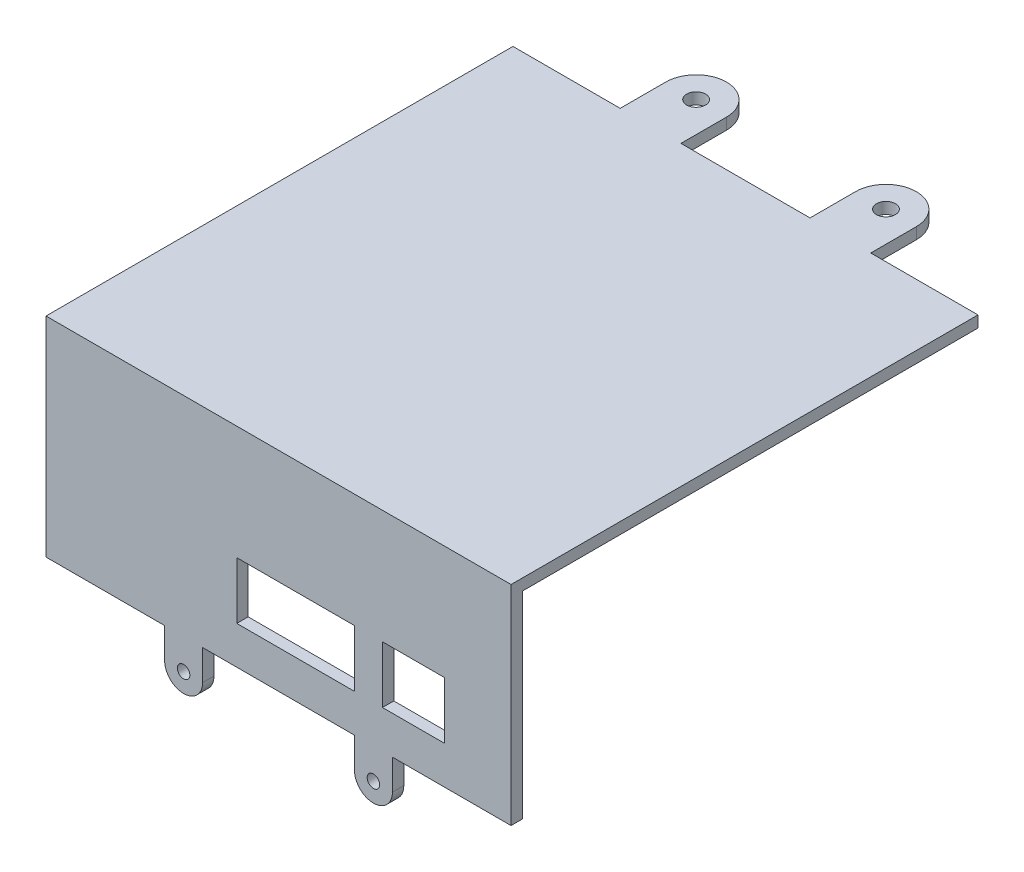
ISO-10303-21;
HEADER;
FILE_DESCRIPTION(('STEP AP214'),'2;1');
FILE_NAME('part.step','',(''),(''),'','','');
FILE_SCHEMA(('AUTOMOTIVE_DESIGN { 1 0 10303 214 1 1 1 1 }'));
ENDSEC;
DATA;
#1=APPLICATION_CONTEXT('core data for automotive mechanical design processes');
#2=APPLICATION_PROTOCOL_DEFINITION('international standard','automotive_design',2000,#1);
#3=PRODUCT_CONTEXT('',#1,'mechanical');
#4=PRODUCT('Part','Part','',(#3));
#5=PRODUCT_RELATED_PRODUCT_CATEGORY('part','',(#4));
#6=PRODUCT_DEFINITION_FORMATION('','',#4);
#7=PRODUCT_DEFINITION_CONTEXT('part definition',#1,'design');
#8=PRODUCT_DEFINITION('design','',#6,#7);
#9=PRODUCT_DEFINITION_SHAPE('','',#8);
#10=(LENGTH_UNIT() NAMED_UNIT(*) SI_UNIT(.MILLI.,.METRE.));
#11=(NAMED_UNIT(*) PLANE_ANGLE_UNIT() SI_UNIT($,.RADIAN.));
#12=(NAMED_UNIT(*) SI_UNIT($,.STERADIAN.) SOLID_ANGLE_UNIT());
#13=UNCERTAINTY_MEASURE_WITH_UNIT(LENGTH_MEASURE(1.E-05),#10,'distance_accuracy_value','');
#14=(GEOMETRIC_REPRESENTATION_CONTEXT(3) GLOBAL_UNCERTAINTY_ASSIGNED_CONTEXT((#13)) GLOBAL_UNIT_ASSIGNED_CONTEXT((#10,
#11,#12)) REPRESENTATION_CONTEXT('',''));
#15=CARTESIAN_POINT('',(0.,0.,0.));
#16=DIRECTION('',(0.,0.,1.));
#17=DIRECTION('',(1.,0.,0.));
#18=AXIS2_PLACEMENT_3D('',#15,#16,#17);
#19=CARTESIAN_POINT('',(-61.25,-52.,60.));
#20=DIRECTION('',(0.,-1.,0.));
#21=DIRECTION('',(0.,0.,-1.));
#22=AXIS2_PLACEMENT_3D('',#19,#20,#21);
#23=PLANE('',#22);
#24=DIRECTION('',(0.,0.,1.));
#25=VECTOR('',#24,1.);
#26=CARTESIAN_POINT('',(30.,-52.,60.));
#27=LINE('',#26,#25);
#28=CARTESIAN_POINT('',(30.,-52.,60.));
#29=VERTEX_POINT('',#28);
#30=CARTESIAN_POINT('',(30.,-52.,63.));
#31=VERTEX_POINT('',#30);
#32=EDGE_CURVE('E357',#29,#31,#27,.T.);
#33=ORIENTED_EDGE('',*,*,#32,.F.);
#34=DIRECTION('',(1.,0.,0.));
#35=VECTOR('',#34,1.);
#36=CARTESIAN_POINT('',(-61.25,-52.,60.));
#37=LINE('',#36,#35);
#38=CARTESIAN_POINT('',(61.25,-52.,60.));
#39=VERTEX_POINT('',#38);
#40=EDGE_CURVE('E532',#29,#39,#37,.T.);
#41=ORIENTED_EDGE('',*,*,#40,.T.);
#42=DIRECTION('',(0.,0.,-1.));
#43=VECTOR('',#42,1.);
#44=CARTESIAN_POINT('',(61.25,-52.,60.));
#45=LINE('',#44,#43);
#46=CARTESIAN_POINT('',(61.25,-52.,63.));
#47=VERTEX_POINT('',#46);
#48=EDGE_CURVE('E509',#47,#39,#45,.T.);
#49=ORIENTED_EDGE('',*,*,#48,.F.);
#50=DIRECTION('',(1.,0.,0.));
#51=VECTOR('',#50,1.);
#52=CARTESIAN_POINT('',(-61.25,-52.,63.));
#53=LINE('',#52,#51);
#54=EDGE_CURVE('E538',#31,#47,#53,.T.);
#55=ORIENTED_EDGE('',*,*,#54,.F.);
#56=EDGE_LOOP('',(#33,#41,#49,#55));
#57=FACE_BOUND('',#56,.T.);
#58=ADVANCED_FACE('F42',(#57),#23,.T.);
#59=CARTESIAN_POINT('',(-61.25,-52.,60.));
#60=VERTEX_POINT('',#59);
#61=CARTESIAN_POINT('',(-30.,-52.,60.));
#62=VERTEX_POINT('',#61);
#63=EDGE_CURVE('E526',#60,#62,#37,.T.);
#64=ORIENTED_EDGE('',*,*,#63,.T.);
#65=DIRECTION('',(0.,0.,1.));
#66=VECTOR('',#65,1.);
#67=CARTESIAN_POINT('',(-30.,-52.,60.));
#68=LINE('',#67,#66);
#69=CARTESIAN_POINT('',(-30.,-52.,63.));
#70=VERTEX_POINT('',#69);
#71=EDGE_CURVE('E404',#62,#70,#68,.T.);
#72=ORIENTED_EDGE('',*,*,#71,.T.);
#73=CARTESIAN_POINT('',(-61.25,-52.,63.));
#74=VERTEX_POINT('',#73);
#75=EDGE_CURVE('E533',#74,#70,#53,.T.);
#76=ORIENTED_EDGE('',*,*,#75,.F.);
#77=DIRECTION('',(0.,0.,-1.));
#78=VECTOR('',#77,1.);
#79=CARTESIAN_POINT('',(-61.25,-52.,60.));
#80=LINE('',#79,#78);
#81=EDGE_CURVE('E521',#74,#60,#80,.T.);
#82=ORIENTED_EDGE('',*,*,#81,.T.);
#83=EDGE_LOOP('',(#64,#72,#76,#82));
#84=FACE_BOUND('',#83,.T.);
#85=ADVANCED_FACE('F645',(#84),#23,.T.);
#86=CARTESIAN_POINT('',(61.25,3.,-60.));
#87=DIRECTION('',(0.,0.,1.));
#88=DIRECTION('',(1.,0.,0.));
#89=AXIS2_PLACEMENT_3D('',#86,#87,#88);
#90=PLANE('',#89);
#91=DIRECTION('',(-1.,0.,0.));
#92=VECTOR('',#91,1.);
#93=CARTESIAN_POINT('',(61.25,3.,-60.));
#94=LINE('',#93,#92);
#95=CARTESIAN_POINT('',(-33.,3.,-60.));
#96=VERTEX_POINT('',#95);
#97=CARTESIAN_POINT('',(-61.25,3.,-60.));
#98=VERTEX_POINT('',#97);
#99=EDGE_CURVE('E549',#96,#98,#94,.T.);
#100=ORIENTED_EDGE('',*,*,#99,.F.);
#101=DIRECTION('',(0.,1.,0.));
#102=VECTOR('',#101,1.);
#103=CARTESIAN_POINT('',(-33.,0.,-60.));
#104=LINE('',#103,#102);
#105=CARTESIAN_POINT('',(-33.,0.,-60.));
#106=VERTEX_POINT('',#105);
#107=EDGE_CURVE('E453',#106,#96,#104,.T.);
#108=ORIENTED_EDGE('',*,*,#107,.F.);
#109=DIRECTION('',(-1.,0.,0.));
#110=VECTOR('',#109,1.);
#111=CARTESIAN_POINT('',(61.25,0.,-60.));
#112=LINE('',#111,#110);
#113=CARTESIAN_POINT('',(-61.25,0.,-60.));
#114=VERTEX_POINT('',#113);
#115=EDGE_CURVE('E565',#106,#114,#112,.T.);
#116=ORIENTED_EDGE('',*,*,#115,.T.);
#117=DIRECTION('',(0.,-1.,0.));
#118=VECTOR('',#117,1.);
#119=CARTESIAN_POINT('',(-61.25,3.,-60.));
#120=LINE('',#119,#118);
#121=EDGE_CURVE('E52',#98,#114,#120,.T.);
#122=ORIENTED_EDGE('',*,*,#121,.F.);
#123=EDGE_LOOP('',(#100,#108,#116,#122));
#124=FACE_BOUND('',#123,.T.);
#125=ADVANCED_FACE('F650',(#124),#90,.F.);
#126=CARTESIAN_POINT('',(17.,0.,-60.));
#127=VERTEX_POINT('',#126);
#128=CARTESIAN_POINT('',(-17.,0.,-60.));
#129=VERTEX_POINT('',#128);
#130=EDGE_CURVE('E569',#127,#129,#112,.T.);
#131=ORIENTED_EDGE('',*,*,#130,.T.);
#132=DIRECTION('',(0.,1.,0.));
#133=VECTOR('',#132,1.);
#134=CARTESIAN_POINT('',(-17.,0.,-60.));
#135=LINE('',#134,#133);
#136=CARTESIAN_POINT('',(-17.,3.,-60.));
#137=VERTEX_POINT('',#136);
#138=EDGE_CURVE('E442',#129,#137,#135,.T.);
#139=ORIENTED_EDGE('',*,*,#138,.T.);
#140=CARTESIAN_POINT('',(17.,3.,-60.));
#141=VERTEX_POINT('',#140);
#142=EDGE_CURVE('E554',#141,#137,#94,.T.);
#143=ORIENTED_EDGE('',*,*,#142,.F.);
#144=DIRECTION('',(0.,1.,0.));
#145=VECTOR('',#144,1.);
#146=CARTESIAN_POINT('',(17.,0.,-60.));
#147=LINE('',#146,#145);
#148=EDGE_CURVE('E478',#127,#141,#147,.T.);
#149=ORIENTED_EDGE('',*,*,#148,.F.);
#150=EDGE_LOOP('',(#131,#139,#143,#149));
#151=FACE_BOUND('',#150,.T.);
#152=ADVANCED_FACE('F676',(#151),#90,.F.);
#153=CARTESIAN_POINT('',(-61.25,3.,60.));
#154=DIRECTION('',(1.,0.,0.));
#155=DIRECTION('',(0.,0.,-1.));
#156=AXIS2_PLACEMENT_3D('',#153,#154,#155);
#157=PLANE('',#156);
#158=DIRECTION('',(0.,0.,1.));
#159=VECTOR('',#158,1.);
#160=CARTESIAN_POINT('',(-61.25,0.,60.));
#161=LINE('',#160,#159);
#162=CARTESIAN_POINT('',(-61.25,0.,60.));
#163=VERTEX_POINT('',#162);
#164=EDGE_CURVE('E530',#114,#163,#161,.T.);
#165=ORIENTED_EDGE('',*,*,#164,.T.);
#166=DIRECTION('',(0.,1.,0.));
#167=VECTOR('',#166,1.);
#168=CARTESIAN_POINT('',(-61.25,-52.,60.));
#169=LINE('',#168,#167);
#170=EDGE_CURVE('E513',#60,#163,#169,.T.);
#171=ORIENTED_EDGE('',*,*,#170,.F.);
#172=ORIENTED_EDGE('',*,*,#81,.F.);
#173=DIRECTION('',(0.,-1.,0.));
#174=VECTOR('',#173,1.);
#175=CARTESIAN_POINT('',(-61.25,-52.,63.));
#176=LINE('',#175,#174);
#177=CARTESIAN_POINT('',(-61.25,3.,63.));
#178=VERTEX_POINT('',#177);
#179=EDGE_CURVE('E517',#178,#74,#176,.T.);
#180=ORIENTED_EDGE('',*,*,#179,.F.);
#181=DIRECTION('',(0.,0.,1.));
#182=VECTOR('',#181,1.);
#183=CARTESIAN_POINT('',(-61.25,3.,60.));
#184=LINE('',#183,#182);
#185=EDGE_CURVE('E542',#98,#178,#184,.T.);
#186=ORIENTED_EDGE('',*,*,#185,.F.);
#187=ORIENTED_EDGE('',*,*,#121,.T.);
#188=EDGE_LOOP('',(#165,#171,#172,#180,#186,#187));
#189=FACE_BOUND('',#188,.T.);
#190=ADVANCED_FACE('F44',(#189),#157,.F.);
#191=CARTESIAN_POINT('',(61.25,3.,60.));
#192=DIRECTION('',(-1.,0.,0.));
#193=DIRECTION('',(0.,0.,1.));
#194=AXIS2_PLACEMENT_3D('',#191,#192,#193);
#195=PLANE('',#194);
#196=DIRECTION('',(0.,0.,-1.));
#197=VECTOR('',#196,1.);
#198=CARTESIAN_POINT('',(61.25,0.,60.));
#199=LINE('',#198,#197);
#200=CARTESIAN_POINT('',(61.25,0.,60.));
#201=VERTEX_POINT('',#200);
#202=CARTESIAN_POINT('',(61.25,0.,-60.));
#203=VERTEX_POINT('',#202);
#204=EDGE_CURVE('E562',#201,#203,#199,.T.);
#205=ORIENTED_EDGE('',*,*,#204,.T.);
#206=DIRECTION('',(0.,-1.,0.));
#207=VECTOR('',#206,1.);
#208=CARTESIAN_POINT('',(61.25,3.,-60.));
#209=LINE('',#208,#207);
#210=CARTESIAN_POINT('',(61.25,3.,-60.));
#211=VERTEX_POINT('',#210);
#212=EDGE_CURVE('E11',#211,#203,#209,.T.);
#213=ORIENTED_EDGE('',*,*,#212,.F.);
#214=DIRECTION('',(0.,0.,-1.));
#215=VECTOR('',#214,1.);
#216=CARTESIAN_POINT('',(61.25,3.,60.));
#217=LINE('',#216,#215);
#218=CARTESIAN_POINT('',(61.25,3.,63.));
#219=VERTEX_POINT('',#218);
#220=EDGE_CURVE('E545',#219,#211,#217,.T.);
#221=ORIENTED_EDGE('',*,*,#220,.F.);
#222=DIRECTION('',(0.,-1.,0.));
#223=VECTOR('',#222,1.);
#224=CARTESIAN_POINT('',(61.25,-52.,63.));
#225=LINE('',#224,#223);
#226=EDGE_CURVE('E505',#219,#47,#225,.T.);
#227=ORIENTED_EDGE('',*,*,#226,.T.);
#228=ORIENTED_EDGE('',*,*,#48,.T.);
#229=DIRECTION('',(0.,1.,0.));
#230=VECTOR('',#229,1.);
#231=CARTESIAN_POINT('',(61.25,-52.,60.));
#232=LINE('',#231,#230);
#233=EDGE_CURVE('E492',#39,#201,#232,.T.);
#234=ORIENTED_EDGE('',*,*,#233,.T.);
#235=EDGE_LOOP('',(#205,#213,#221,#227,#228,#234));
#236=FACE_BOUND('',#235,.T.);
#237=ADVANCED_FACE('F589',(#236),#195,.F.);
#238=CARTESIAN_POINT('',(33.,0.,-60.));
#239=VERTEX_POINT('',#238);
#240=EDGE_CURVE('E546',#203,#239,#112,.T.);
#241=ORIENTED_EDGE('',*,*,#240,.T.);
#242=DIRECTION('',(0.,1.,0.));
#243=VECTOR('',#242,1.);
#244=CARTESIAN_POINT('',(33.,0.,-60.));
#245=LINE('',#244,#243);
#246=CARTESIAN_POINT('',(33.,3.,-60.));
#247=VERTEX_POINT('',#246);
#248=EDGE_CURVE('E496',#239,#247,#245,.T.);
#249=ORIENTED_EDGE('',*,*,#248,.T.);
#250=EDGE_CURVE('E550',#211,#247,#94,.T.);
#251=ORIENTED_EDGE('',*,*,#250,.F.);
#252=ORIENTED_EDGE('',*,*,#212,.T.);
#253=EDGE_LOOP('',(#241,#249,#251,#252));
#254=FACE_BOUND('',#253,.T.);
#255=ADVANCED_FACE('F671',(#254),#90,.F.);
#256=CARTESIAN_POINT('',(0.,3.,0.));
#257=DIRECTION('',(0.,1.,0.));
#258=DIRECTION('',(0.,0.,1.));
#259=AXIS2_PLACEMENT_3D('',#256,#257,#258);
#260=PLANE('',#259);
#261=CARTESIAN_POINT('',(-25.,3.,-72.));
#262=DIRECTION('',(0.,1.,0.));
#263=DIRECTION('',(0.,0.,1.));
#264=AXIS2_PLACEMENT_3D('',#261,#262,#263);
#265=CIRCLE('',#264,2.49999999999999);
#266=CARTESIAN_POINT('',(-25.,3.,-69.5));
#267=VERTEX_POINT('',#266);
#268=EDGE_CURVE('E408',#267,#267,#265,.T.);
#269=ORIENTED_EDGE('',*,*,#268,.F.);
#270=EDGE_LOOP('',(#269));
#271=FACE_BOUND('',#270,.T.);
#272=CARTESIAN_POINT('',(25.,3.,-72.));
#273=DIRECTION('',(0.,1.,0.));
#274=DIRECTION('',(0.,0.,1.));
#275=AXIS2_PLACEMENT_3D('',#272,#273,#274);
#276=CIRCLE('',#275,2.49999999999999);
#277=CARTESIAN_POINT('',(25.,3.,-69.5));
#278=VERTEX_POINT('',#277);
#279=EDGE_CURVE('E420',#278,#278,#276,.T.);
#280=ORIENTED_EDGE('',*,*,#279,.F.);
#281=EDGE_LOOP('',(#280));
#282=FACE_BOUND('',#281,.T.);
#283=ORIENTED_EDGE('',*,*,#185,.T.);
#284=DIRECTION('',(1.,0.,0.));
#285=VECTOR('',#284,1.);
#286=CARTESIAN_POINT('',(-61.25,3.,63.));
#287=LINE('',#286,#285);
#288=EDGE_CURVE('E525',#178,#219,#287,.T.);
#289=ORIENTED_EDGE('',*,*,#288,.T.);
#290=ORIENTED_EDGE('',*,*,#220,.T.);
#291=ORIENTED_EDGE('',*,*,#250,.T.);
#292=DIRECTION('',(0.,0.,-1.));
#293=VECTOR('',#292,1.);
#294=CARTESIAN_POINT('',(33.,3.,-60.));
#295=LINE('',#294,#293);
#296=CARTESIAN_POINT('',(33.,3.,-72.));
#297=VERTEX_POINT('',#296);
#298=EDGE_CURVE('E482',#247,#297,#295,.T.);
#299=ORIENTED_EDGE('',*,*,#298,.T.);
#300=CARTESIAN_POINT('',(25.,3.,-72.));
#301=DIRECTION('',(0.,1.,0.));
#302=DIRECTION('',(0.,0.,-1.));
#303=AXIS2_PLACEMENT_3D('',#300,#301,#302);
#304=CIRCLE('',#303,8.);
#305=CARTESIAN_POINT('',(17.,3.,-72.));
#306=VERTEX_POINT('',#305);
#307=EDGE_CURVE('E470',#297,#306,#304,.T.);
#308=ORIENTED_EDGE('',*,*,#307,.T.);
#309=DIRECTION('',(0.,0.,1.));
#310=VECTOR('',#309,1.);
#311=CARTESIAN_POINT('',(17.,3.,-60.));
#312=LINE('',#311,#310);
#313=EDGE_CURVE('E457',#306,#141,#312,.T.);
#314=ORIENTED_EDGE('',*,*,#313,.T.);
#315=ORIENTED_EDGE('',*,*,#142,.T.);
#316=DIRECTION('',(0.,0.,-1.));
#317=VECTOR('',#316,1.);
#318=CARTESIAN_POINT('',(-17.,3.,-60.));
#319=LINE('',#318,#317);
#320=CARTESIAN_POINT('',(-17.,3.,-72.));
#321=VERTEX_POINT('',#320);
#322=EDGE_CURVE('E428',#137,#321,#319,.T.);
#323=ORIENTED_EDGE('',*,*,#322,.T.);
#324=CARTESIAN_POINT('',(-25.,3.,-72.));
#325=DIRECTION('',(0.,1.,0.));
#326=DIRECTION('',(0.,0.,1.));
#327=AXIS2_PLACEMENT_3D('',#324,#325,#326);
#328=CIRCLE('',#327,8.);
#329=CARTESIAN_POINT('',(-33.,3.,-72.));
#330=VERTEX_POINT('',#329);
#331=EDGE_CURVE('E446',#321,#330,#328,.T.);
#332=ORIENTED_EDGE('',*,*,#331,.T.);
#333=DIRECTION('',(0.,0.,1.));
#334=VECTOR('',#333,1.);
#335=CARTESIAN_POINT('',(-33.,3.,-60.));
#336=LINE('',#335,#334);
#337=EDGE_CURVE('E434',#330,#96,#336,.T.);
#338=ORIENTED_EDGE('',*,*,#337,.T.);
#339=ORIENTED_EDGE('',*,*,#99,.T.);
#340=EDGE_LOOP('',(#283,#289,#290,#291,#299,#308,#314,#315,#323,#332,#338,#339));
#341=FACE_BOUND('',#340,.T.);
#342=ADVANCED_FACE('F665',(#271,#282,#341),#260,.T.);
#343=CARTESIAN_POINT('',(0.,0.,0.));
#344=DIRECTION('',(0.,1.,0.));
#345=DIRECTION('',(0.,0.,1.));
#346=AXIS2_PLACEMENT_3D('',#343,#344,#345);
#347=PLANE('',#346);
#348=CARTESIAN_POINT('',(-25.,0.,-72.));
#349=DIRECTION('',(0.,1.,0.));
#350=DIRECTION('',(0.,0.,1.));
#351=AXIS2_PLACEMENT_3D('',#348,#349,#350);
#352=CIRCLE('',#351,2.49999999999999);
#353=CARTESIAN_POINT('',(-25.,0.,-69.5));
#354=VERTEX_POINT('',#353);
#355=EDGE_CURVE('E46',#354,#354,#352,.T.);
#356=ORIENTED_EDGE('',*,*,#355,.T.);
#357=EDGE_LOOP('',(#356));
#358=FACE_BOUND('',#357,.T.);
#359=CARTESIAN_POINT('',(25.,0.,-72.));
#360=DIRECTION('',(0.,1.,0.));
#361=DIRECTION('',(0.,0.,1.));
#362=AXIS2_PLACEMENT_3D('',#359,#360,#361);
#363=CIRCLE('',#362,2.49999999999999);
#364=CARTESIAN_POINT('',(25.,0.,-69.5));
#365=VERTEX_POINT('',#364);
#366=EDGE_CURVE('E424',#365,#365,#363,.T.);
#367=ORIENTED_EDGE('',*,*,#366,.T.);
#368=EDGE_LOOP('',(#367));
#369=FACE_BOUND('',#368,.T.);
#370=ORIENTED_EDGE('',*,*,#164,.F.);
#371=ORIENTED_EDGE('',*,*,#115,.F.);
#372=DIRECTION('',(0.,0.,1.));
#373=VECTOR('',#372,1.);
#374=CARTESIAN_POINT('',(-33.,0.,-60.));
#375=LINE('',#374,#373);
#376=CARTESIAN_POINT('',(-33.,0.,-72.));
#377=VERTEX_POINT('',#376);
#378=EDGE_CURVE('E438',#377,#106,#375,.T.);
#379=ORIENTED_EDGE('',*,*,#378,.F.);
#380=CARTESIAN_POINT('',(-25.,0.,-72.));
#381=DIRECTION('',(0.,1.,0.));
#382=DIRECTION('',(0.,0.,1.));
#383=AXIS2_PLACEMENT_3D('',#380,#381,#382);
#384=CIRCLE('',#383,8.);
#385=CARTESIAN_POINT('',(-17.,0.,-72.));
#386=VERTEX_POINT('',#385);
#387=EDGE_CURVE('E433',#386,#377,#384,.T.);
#388=ORIENTED_EDGE('',*,*,#387,.F.);
#389=DIRECTION('',(0.,0.,-1.));
#390=VECTOR('',#389,1.);
#391=CARTESIAN_POINT('',(-17.,0.,-60.));
#392=LINE('',#391,#390);
#393=EDGE_CURVE('E429',#129,#386,#392,.T.);
#394=ORIENTED_EDGE('',*,*,#393,.F.);
#395=ORIENTED_EDGE('',*,*,#130,.F.);
#396=DIRECTION('',(0.,0.,1.));
#397=VECTOR('',#396,1.);
#398=CARTESIAN_POINT('',(17.,0.,-60.));
#399=LINE('',#398,#397);
#400=CARTESIAN_POINT('',(17.,0.,-72.));
#401=VERTEX_POINT('',#400);
#402=EDGE_CURVE('E466',#401,#127,#399,.T.);
#403=ORIENTED_EDGE('',*,*,#402,.F.);
#404=CARTESIAN_POINT('',(25.,0.,-72.));
#405=DIRECTION('',(0.,1.,0.));
#406=DIRECTION('',(0.,0.,-1.));
#407=AXIS2_PLACEMENT_3D('',#404,#405,#406);
#408=CIRCLE('',#407,8.);
#409=CARTESIAN_POINT('',(33.,0.,-72.));
#410=VERTEX_POINT('',#409);
#411=EDGE_CURVE('E474',#410,#401,#408,.T.);
#412=ORIENTED_EDGE('',*,*,#411,.F.);
#413=DIRECTION('',(0.,0.,-1.));
#414=VECTOR('',#413,1.);
#415=CARTESIAN_POINT('',(33.,0.,-60.));
#416=LINE('',#415,#414);
#417=EDGE_CURVE('E469',#239,#410,#416,.T.);
#418=ORIENTED_EDGE('',*,*,#417,.F.);
#419=ORIENTED_EDGE('',*,*,#240,.F.);
#420=ORIENTED_EDGE('',*,*,#204,.F.);
#421=DIRECTION('',(1.,0.,0.));
#422=VECTOR('',#421,1.);
#423=CARTESIAN_POINT('',(61.25,0.,60.));
#424=LINE('',#423,#422);
#425=EDGE_CURVE('E558',#163,#201,#424,.T.);
#426=ORIENTED_EDGE('',*,*,#425,.F.);
#427=EDGE_LOOP('',(#370,#371,#379,#388,#394,#395,#403,#412,#418,#419,#420,#426));
#428=FACE_BOUND('',#427,.T.);
#429=ADVANCED_FACE('F580',(#358,#369,#428),#347,.F.);
#430=CARTESIAN_POINT('',(-61.25,-52.,60.));
#431=DIRECTION('',(0.,0.,-1.));
#432=DIRECTION('',(-1.,0.,0.));
#433=AXIS2_PLACEMENT_3D('',#430,#431,#432);
#434=PLANE('',#433);
#435=DIRECTION('',(0.,1.,0.));
#436=VECTOR('',#435,1.);
#437=CARTESIAN_POINT('',(-11.,-52.,60.));
#438=LINE('',#437,#436);
#439=CARTESIAN_POINT('',(-11.,-42.,60.));
#440=VERTEX_POINT('',#439);
#441=CARTESIAN_POINT('',(-11.,-27.,60.));
#442=VERTEX_POINT('',#441);
#443=EDGE_CURVE('E325',#440,#442,#438,.T.);
#444=ORIENTED_EDGE('',*,*,#443,.F.);
#445=DIRECTION('',(-1.,0.,0.));
#446=VECTOR('',#445,1.);
#447=CARTESIAN_POINT('',(-61.25,-42.,60.));
#448=LINE('',#447,#446);
#449=CARTESIAN_POINT('',(20.,-42.,60.));
#450=VERTEX_POINT('',#449);
#451=EDGE_CURVE('E317',#450,#440,#448,.T.);
#452=ORIENTED_EDGE('',*,*,#451,.F.);
#453=DIRECTION('',(0.,-1.,0.));
#454=VECTOR('',#453,1.);
#455=CARTESIAN_POINT('',(20.,-52.,60.));
#456=LINE('',#455,#454);
#457=CARTESIAN_POINT('',(20.,-27.,60.));
#458=VERTEX_POINT('',#457);
#459=EDGE_CURVE('E246',#458,#450,#456,.T.);
#460=ORIENTED_EDGE('',*,*,#459,.F.);
#461=DIRECTION('',(1.,0.,0.));
#462=VECTOR('',#461,1.);
#463=CARTESIAN_POINT('',(-61.25,-27.,60.));
#464=LINE('',#463,#462);
#465=EDGE_CURVE('E322',#442,#458,#464,.T.);
#466=ORIENTED_EDGE('',*,*,#465,.F.);
#467=EDGE_LOOP('',(#444,#452,#460,#466));
#468=FACE_BOUND('',#467,.T.);
#469=DIRECTION('',(0.,1.,0.));
#470=VECTOR('',#469,1.);
#471=CARTESIAN_POINT('',(27.37,-52.,60.));
#472=LINE('',#471,#470);
#473=CARTESIAN_POINT('',(27.37,-42.,60.));
#474=VERTEX_POINT('',#473);
#475=CARTESIAN_POINT('',(27.37,-27.,60.));
#476=VERTEX_POINT('',#475);
#477=EDGE_CURVE('E314',#474,#476,#472,.T.);
#478=ORIENTED_EDGE('',*,*,#477,.F.);
#479=DIRECTION('',(-1.,0.,0.));
#480=VECTOR('',#479,1.);
#481=CARTESIAN_POINT('',(-61.25,-42.,60.));
#482=LINE('',#481,#480);
#483=CARTESIAN_POINT('',(43.67,-42.,60.));
#484=VERTEX_POINT('',#483);
#485=EDGE_CURVE('E275',#484,#474,#482,.T.);
#486=ORIENTED_EDGE('',*,*,#485,.F.);
#487=DIRECTION('',(0.,-1.,0.));
#488=VECTOR('',#487,1.);
#489=CARTESIAN_POINT('',(43.67,-52.,60.));
#490=LINE('',#489,#488);
#491=CARTESIAN_POINT('',(43.67,-27.,60.));
#492=VERTEX_POINT('',#491);
#493=EDGE_CURVE('E308',#492,#484,#490,.T.);
#494=ORIENTED_EDGE('',*,*,#493,.F.);
#495=DIRECTION('',(1.,0.,0.));
#496=VECTOR('',#495,1.);
#497=CARTESIAN_POINT('',(-61.25,-27.,60.));
#498=LINE('',#497,#496);
#499=EDGE_CURVE('E311',#476,#492,#498,.T.);
#500=ORIENTED_EDGE('',*,*,#499,.F.);
#501=EDGE_LOOP('',(#478,#486,#494,#500));
#502=FACE_BOUND('',#501,.T.);
#503=CARTESIAN_POINT('',(25.,-60.,60.));
#504=DIRECTION('',(0.,0.,-1.));
#505=DIRECTION('',(-1.,0.,0.));
#506=AXIS2_PLACEMENT_3D('',#503,#504,#505);
#507=CIRCLE('',#506,1.64999999999997);
#508=CARTESIAN_POINT('',(23.35,-60.,60.));
#509=VERTEX_POINT('',#508);
#510=EDGE_CURVE('E332',#509,#509,#507,.T.);
#511=ORIENTED_EDGE('',*,*,#510,.F.);
#512=EDGE_LOOP('',(#511));
#513=FACE_BOUND('',#512,.T.);
#514=CARTESIAN_POINT('',(-25.,-60.,60.));
#515=DIRECTION('',(0.,0.,-1.));
#516=DIRECTION('',(-1.,0.,0.));
#517=AXIS2_PLACEMENT_3D('',#514,#515,#516);
#518=CIRCLE('',#517,1.64999999999997);
#519=CARTESIAN_POINT('',(-26.65,-60.,60.));
#520=VERTEX_POINT('',#519);
#521=EDGE_CURVE('E340',#520,#520,#518,.T.);
#522=ORIENTED_EDGE('',*,*,#521,.F.);
#523=EDGE_LOOP('',(#522));
#524=FACE_BOUND('',#523,.T.);
#525=ORIENTED_EDGE('',*,*,#170,.T.);
#526=ORIENTED_EDGE('',*,*,#425,.T.);
#527=ORIENTED_EDGE('',*,*,#233,.F.);
#528=ORIENTED_EDGE('',*,*,#40,.F.);
#529=DIRECTION('',(0.,1.,0.));
#530=VECTOR('',#529,1.);
#531=CARTESIAN_POINT('',(30.,-52.,60.));
#532=LINE('',#531,#530);
#533=CARTESIAN_POINT('',(30.,-60.,60.));
#534=VERTEX_POINT('',#533);
#535=EDGE_CURVE('E345',#534,#29,#532,.T.);
#536=ORIENTED_EDGE('',*,*,#535,.F.);
#537=CARTESIAN_POINT('',(25.,-60.,60.));
#538=DIRECTION('',(0.,0.,1.));
#539=DIRECTION('',(-1.,0.,0.));
#540=AXIS2_PLACEMENT_3D('',#537,#538,#539);
#541=CIRCLE('',#540,5.);
#542=CARTESIAN_POINT('',(20.,-60.,60.));
#543=VERTEX_POINT('',#542);
#544=EDGE_CURVE('E353',#543,#534,#541,.T.);
#545=ORIENTED_EDGE('',*,*,#544,.F.);
#546=DIRECTION('',(0.,-1.,0.));
#547=VECTOR('',#546,1.);
#548=CARTESIAN_POINT('',(20.,-52.,60.));
#549=LINE('',#548,#547);
#550=CARTESIAN_POINT('',(20.,-52.,60.));
#551=VERTEX_POINT('',#550);
#552=EDGE_CURVE('E348',#551,#543,#549,.T.);
#553=ORIENTED_EDGE('',*,*,#552,.F.);
#554=CARTESIAN_POINT('',(-20.,-52.,60.));
#555=VERTEX_POINT('',#554);
#556=EDGE_CURVE('E531',#555,#551,#37,.T.);
#557=ORIENTED_EDGE('',*,*,#556,.F.);
#558=DIRECTION('',(0.,1.,0.));
#559=VECTOR('',#558,1.);
#560=CARTESIAN_POINT('',(-20.,-52.,60.));
#561=LINE('',#560,#559);
#562=CARTESIAN_POINT('',(-20.,-60.,60.));
#563=VERTEX_POINT('',#562);
#564=EDGE_CURVE('E390',#563,#555,#561,.T.);
#565=ORIENTED_EDGE('',*,*,#564,.F.);
#566=CARTESIAN_POINT('',(-25.,-60.,60.));
#567=DIRECTION('',(0.,0.,1.));
#568=DIRECTION('',(1.,0.,0.));
#569=AXIS2_PLACEMENT_3D('',#566,#567,#568);
#570=CIRCLE('',#569,5.);
#571=CARTESIAN_POINT('',(-30.,-60.,60.));
#572=VERTEX_POINT('',#571);
#573=EDGE_CURVE('E385',#572,#563,#570,.T.);
#574=ORIENTED_EDGE('',*,*,#573,.F.);
#575=DIRECTION('',(0.,-1.,0.));
#576=VECTOR('',#575,1.);
#577=CARTESIAN_POINT('',(-30.,-52.,60.));
#578=LINE('',#577,#576);
#579=EDGE_CURVE('E381',#62,#572,#578,.T.);
#580=ORIENTED_EDGE('',*,*,#579,.F.);
#581=ORIENTED_EDGE('',*,*,#63,.F.);
#582=EDGE_LOOP('',(#525,#526,#527,#528,#536,#545,#553,#557,#565,#574,#580,#581));
#583=FACE_BOUND('',#582,.T.);
#584=ADVANCED_FACE('F586',(#468,#502,#513,#524,#583),#434,.T.);
#585=DIRECTION('',(0.,0.,1.));
#586=VECTOR('',#585,1.);
#587=CARTESIAN_POINT('',(20.,-52.,60.));
#588=LINE('',#587,#586);
#589=CARTESIAN_POINT('',(20.,-52.,63.));
#590=VERTEX_POINT('',#589);
#591=EDGE_CURVE('E374',#551,#590,#588,.T.);
#592=ORIENTED_EDGE('',*,*,#591,.T.);
#593=CARTESIAN_POINT('',(-20.,-52.,63.));
#594=VERTEX_POINT('',#593);
#595=EDGE_CURVE('E537',#594,#590,#53,.T.);
#596=ORIENTED_EDGE('',*,*,#595,.F.);
#597=DIRECTION('',(0.,0.,1.));
#598=VECTOR('',#597,1.);
#599=CARTESIAN_POINT('',(-20.,-52.,60.));
#600=LINE('',#599,#598);
#601=EDGE_CURVE('E409',#555,#594,#600,.T.);
#602=ORIENTED_EDGE('',*,*,#601,.F.);
#603=ORIENTED_EDGE('',*,*,#556,.T.);
#604=EDGE_LOOP('',(#592,#596,#602,#603));
#605=FACE_BOUND('',#604,.T.);
#606=ADVANCED_FACE('F603',(#605),#23,.T.);
#607=CARTESIAN_POINT('',(-61.25,-52.,63.));
#608=DIRECTION('',(0.,0.,1.));
#609=DIRECTION('',(1.,0.,0.));
#610=AXIS2_PLACEMENT_3D('',#607,#608,#609);
#611=PLANE('',#610);
#612=DIRECTION('',(0.,-1.,0.));
#613=VECTOR('',#612,1.);
#614=CARTESIAN_POINT('',(-11.,-27.,63.));
#615=LINE('',#614,#613);
#616=CARTESIAN_POINT('',(-11.,-27.,63.));
#617=VERTEX_POINT('',#616);
#618=CARTESIAN_POINT('',(-11.,-42.,63.));
#619=VERTEX_POINT('',#618);
#620=EDGE_CURVE('E260',#617,#619,#615,.T.);
#621=ORIENTED_EDGE('',*,*,#620,.F.);
#622=DIRECTION('',(-1.,0.,0.));
#623=VECTOR('',#622,1.);
#624=CARTESIAN_POINT('',(-11.,-27.,63.));
#625=LINE('',#624,#623);
#626=CARTESIAN_POINT('',(20.,-27.,63.));
#627=VERTEX_POINT('',#626);
#628=EDGE_CURVE('E265',#627,#617,#625,.T.);
#629=ORIENTED_EDGE('',*,*,#628,.F.);
#630=DIRECTION('',(0.,1.,0.));
#631=VECTOR('',#630,1.);
#632=CARTESIAN_POINT('',(20.,-27.,63.));
#633=LINE('',#632,#631);
#634=CARTESIAN_POINT('',(20.,-42.,63.));
#635=VERTEX_POINT('',#634);
#636=EDGE_CURVE('E243',#635,#627,#633,.T.);
#637=ORIENTED_EDGE('',*,*,#636,.F.);
#638=DIRECTION('',(1.,0.,0.));
#639=VECTOR('',#638,1.);
#640=CARTESIAN_POINT('',(-11.,-42.,63.));
#641=LINE('',#640,#639);
#642=EDGE_CURVE('E254',#619,#635,#641,.T.);
#643=ORIENTED_EDGE('',*,*,#642,.F.);
#644=EDGE_LOOP('',(#621,#629,#637,#643));
#645=FACE_BOUND('',#644,.T.);
#646=DIRECTION('',(0.,-1.,0.));
#647=VECTOR('',#646,1.);
#648=CARTESIAN_POINT('',(27.37,-27.,63.));
#649=LINE('',#648,#647);
#650=CARTESIAN_POINT('',(27.37,-27.,63.));
#651=VERTEX_POINT('',#650);
#652=CARTESIAN_POINT('',(27.37,-42.,63.));
#653=VERTEX_POINT('',#652);
#654=EDGE_CURVE('E280',#651,#653,#649,.T.);
#655=ORIENTED_EDGE('',*,*,#654,.F.);
#656=DIRECTION('',(-1.,0.,0.));
#657=VECTOR('',#656,1.);
#658=CARTESIAN_POINT('',(27.37,-27.,63.));
#659=LINE('',#658,#657);
#660=CARTESIAN_POINT('',(43.67,-27.,63.));
#661=VERTEX_POINT('',#660);
#662=EDGE_CURVE('E290',#661,#651,#659,.T.);
#663=ORIENTED_EDGE('',*,*,#662,.F.);
#664=DIRECTION('',(0.,1.,0.));
#665=VECTOR('',#664,1.);
#666=CARTESIAN_POINT('',(43.67,-27.,63.));
#667=LINE('',#666,#665);
#668=CARTESIAN_POINT('',(43.67,-42.,63.));
#669=VERTEX_POINT('',#668);
#670=EDGE_CURVE('E286',#669,#661,#667,.T.);
#671=ORIENTED_EDGE('',*,*,#670,.F.);
#672=DIRECTION('',(1.,0.,0.));
#673=VECTOR('',#672,1.);
#674=CARTESIAN_POINT('',(27.37,-42.,63.));
#675=LINE('',#674,#673);
#676=EDGE_CURVE('E283',#653,#669,#675,.T.);
#677=ORIENTED_EDGE('',*,*,#676,.F.);
#678=EDGE_LOOP('',(#655,#663,#671,#677));
#679=FACE_BOUND('',#678,.T.);
#680=CARTESIAN_POINT('',(25.,-60.,63.));
#681=DIRECTION('',(0.,0.,1.));
#682=DIRECTION('',(1.,0.,0.));
#683=AXIS2_PLACEMENT_3D('',#680,#681,#682);
#684=CIRCLE('',#683,1.64999999999998);
#685=CARTESIAN_POINT('',(26.65,-60.,63.));
#686=VERTEX_POINT('',#685);
#687=EDGE_CURVE('E328',#686,#686,#684,.T.);
#688=ORIENTED_EDGE('',*,*,#687,.F.);
#689=EDGE_LOOP('',(#688));
#690=FACE_BOUND('',#689,.T.);
#691=CARTESIAN_POINT('',(-25.,-60.,63.));
#692=DIRECTION('',(0.,0.,1.));
#693=DIRECTION('',(1.,0.,0.));
#694=AXIS2_PLACEMENT_3D('',#691,#692,#693);
#695=CIRCLE('',#694,1.64999999999998);
#696=CARTESIAN_POINT('',(-23.35,-60.,63.));
#697=VERTEX_POINT('',#696);
#698=EDGE_CURVE('E336',#697,#697,#695,.T.);
#699=ORIENTED_EDGE('',*,*,#698,.F.);
#700=EDGE_LOOP('',(#699));
#701=FACE_BOUND('',#700,.T.);
#702=ORIENTED_EDGE('',*,*,#75,.T.);
#703=DIRECTION('',(0.,-1.,0.));
#704=VECTOR('',#703,1.);
#705=CARTESIAN_POINT('',(-30.,-52.,63.));
#706=LINE('',#705,#704);
#707=CARTESIAN_POINT('',(-30.,-60.,63.));
#708=VERTEX_POINT('',#707);
#709=EDGE_CURVE('E370',#70,#708,#706,.T.);
#710=ORIENTED_EDGE('',*,*,#709,.T.);
#711=CARTESIAN_POINT('',(-25.,-60.,63.));
#712=DIRECTION('',(0.,0.,1.));
#713=DIRECTION('',(1.,0.,0.));
#714=AXIS2_PLACEMENT_3D('',#711,#712,#713);
#715=CIRCLE('',#714,5.);
#716=CARTESIAN_POINT('',(-20.,-60.,63.));
#717=VERTEX_POINT('',#716);
#718=EDGE_CURVE('E397',#708,#717,#715,.T.);
#719=ORIENTED_EDGE('',*,*,#718,.T.);
#720=DIRECTION('',(0.,1.,0.));
#721=VECTOR('',#720,1.);
#722=CARTESIAN_POINT('',(-20.,-52.,63.));
#723=LINE('',#722,#721);
#724=EDGE_CURVE('E386',#717,#594,#723,.T.);
#725=ORIENTED_EDGE('',*,*,#724,.T.);
#726=ORIENTED_EDGE('',*,*,#595,.T.);
#727=DIRECTION('',(0.,-1.,0.));
#728=VECTOR('',#727,1.);
#729=CARTESIAN_POINT('',(20.,-52.,63.));
#730=LINE('',#729,#728);
#731=CARTESIAN_POINT('',(20.,-60.,63.));
#732=VERTEX_POINT('',#731);
#733=EDGE_CURVE('E360',#590,#732,#730,.T.);
#734=ORIENTED_EDGE('',*,*,#733,.T.);
#735=CARTESIAN_POINT('',(25.,-60.,63.));
#736=DIRECTION('',(0.,0.,1.));
#737=DIRECTION('',(-1.,0.,0.));
#738=AXIS2_PLACEMENT_3D('',#735,#736,#737);
#739=CIRCLE('',#738,5.);
#740=CARTESIAN_POINT('',(30.,-60.,63.));
#741=VERTEX_POINT('',#740);
#742=EDGE_CURVE('E349',#732,#741,#739,.T.);
#743=ORIENTED_EDGE('',*,*,#742,.T.);
#744=DIRECTION('',(0.,1.,0.));
#745=VECTOR('',#744,1.);
#746=CARTESIAN_POINT('',(30.,-52.,63.));
#747=LINE('',#746,#745);
#748=EDGE_CURVE('E344',#741,#31,#747,.T.);
#749=ORIENTED_EDGE('',*,*,#748,.T.);
#750=ORIENTED_EDGE('',*,*,#54,.T.);
#751=ORIENTED_EDGE('',*,*,#226,.F.);
#752=ORIENTED_EDGE('',*,*,#288,.F.);
#753=ORIENTED_EDGE('',*,*,#179,.T.);
#754=EDGE_LOOP('',(#702,#710,#719,#725,#726,#734,#743,#749,#750,#751,#752,#753));
#755=FACE_BOUND('',#754,.T.);
#756=ADVANCED_FACE('F262',(#645,#679,#690,#701,#755),#611,.T.);
#757=CARTESIAN_POINT('',(17.,0.,-60.));
#758=DIRECTION('',(-1.,0.,0.));
#759=DIRECTION('',(0.,0.,1.));
#760=AXIS2_PLACEMENT_3D('',#757,#758,#759);
#761=PLANE('',#760);
#762=ORIENTED_EDGE('',*,*,#313,.F.);
#763=DIRECTION('',(0.,1.,0.));
#764=VECTOR('',#763,1.);
#765=CARTESIAN_POINT('',(17.,0.,-72.));
#766=LINE('',#765,#764);
#767=EDGE_CURVE('E489',#401,#306,#766,.T.);
#768=ORIENTED_EDGE('',*,*,#767,.F.);
#769=ORIENTED_EDGE('',*,*,#402,.T.);
#770=ORIENTED_EDGE('',*,*,#148,.T.);
#771=EDGE_LOOP('',(#762,#768,#769,#770));
#772=FACE_BOUND('',#771,.T.);
#773=ADVANCED_FACE('F659',(#772),#761,.T.);
#774=CARTESIAN_POINT('',(25.,0.,-72.));
#775=DIRECTION('',(0.,1.,0.));
#776=DIRECTION('',(0.,0.,1.));
#777=AXIS2_PLACEMENT_3D('',#774,#775,#776);
#778=CYLINDRICAL_SURFACE('',#777,8.);
#779=ORIENTED_EDGE('',*,*,#307,.F.);
#780=DIRECTION('',(0.,1.,0.));
#781=VECTOR('',#780,1.);
#782=CARTESIAN_POINT('',(33.,0.,-72.));
#783=LINE('',#782,#781);
#784=EDGE_CURVE('E493',#410,#297,#783,.T.);
#785=ORIENTED_EDGE('',*,*,#784,.F.);
#786=ORIENTED_EDGE('',*,*,#411,.T.);
#787=ORIENTED_EDGE('',*,*,#767,.T.);
#788=EDGE_LOOP('',(#779,#785,#786,#787));
#789=FACE_BOUND('',#788,.T.);
#790=ADVANCED_FACE('F717',(#789),#778,.T.);
#791=CARTESIAN_POINT('',(33.,0.,-60.));
#792=DIRECTION('',(1.,0.,0.));
#793=DIRECTION('',(0.,0.,-1.));
#794=AXIS2_PLACEMENT_3D('',#791,#792,#793);
#795=PLANE('',#794);
#796=ORIENTED_EDGE('',*,*,#298,.F.);
#797=ORIENTED_EDGE('',*,*,#248,.F.);
#798=ORIENTED_EDGE('',*,*,#417,.T.);
#799=ORIENTED_EDGE('',*,*,#784,.T.);
#800=EDGE_LOOP('',(#796,#797,#798,#799));
#801=FACE_BOUND('',#800,.T.);
#802=ADVANCED_FACE('F710',(#801),#795,.T.);
#803=CARTESIAN_POINT('',(-33.,0.,-60.));
#804=DIRECTION('',(-1.,0.,0.));
#805=DIRECTION('',(0.,0.,1.));
#806=AXIS2_PLACEMENT_3D('',#803,#804,#805);
#807=PLANE('',#806);
#808=ORIENTED_EDGE('',*,*,#337,.F.);
#809=DIRECTION('',(0.,1.,0.));
#810=VECTOR('',#809,1.);
#811=CARTESIAN_POINT('',(-33.,0.,-72.));
#812=LINE('',#811,#810);
#813=EDGE_CURVE('E458',#377,#330,#812,.T.);
#814=ORIENTED_EDGE('',*,*,#813,.F.);
#815=ORIENTED_EDGE('',*,*,#378,.T.);
#816=ORIENTED_EDGE('',*,*,#107,.T.);
#817=EDGE_LOOP('',(#808,#814,#815,#816));
#818=FACE_BOUND('',#817,.T.);
#819=ADVANCED_FACE('F708',(#818),#807,.T.);
#820=CARTESIAN_POINT('',(-25.,0.,-72.));
#821=DIRECTION('',(0.,1.,0.));
#822=DIRECTION('',(0.,0.,1.));
#823=AXIS2_PLACEMENT_3D('',#820,#821,#822);
#824=CYLINDRICAL_SURFACE('',#823,8.);
#825=ORIENTED_EDGE('',*,*,#331,.F.);
#826=DIRECTION('',(0.,1.,0.));
#827=VECTOR('',#826,1.);
#828=CARTESIAN_POINT('',(-17.,0.,-72.));
#829=LINE('',#828,#827);
#830=EDGE_CURVE('E461',#386,#321,#829,.T.);
#831=ORIENTED_EDGE('',*,*,#830,.F.);
#832=ORIENTED_EDGE('',*,*,#387,.T.);
#833=ORIENTED_EDGE('',*,*,#813,.T.);
#834=EDGE_LOOP('',(#825,#831,#832,#833));
#835=FACE_BOUND('',#834,.T.);
#836=ADVANCED_FACE('F701',(#835),#824,.T.);
#837=CARTESIAN_POINT('',(-17.,0.,-60.));
#838=DIRECTION('',(1.,0.,0.));
#839=DIRECTION('',(0.,0.,-1.));
#840=AXIS2_PLACEMENT_3D('',#837,#838,#839);
#841=PLANE('',#840);
#842=ORIENTED_EDGE('',*,*,#322,.F.);
#843=ORIENTED_EDGE('',*,*,#138,.F.);
#844=ORIENTED_EDGE('',*,*,#393,.T.);
#845=ORIENTED_EDGE('',*,*,#830,.T.);
#846=EDGE_LOOP('',(#842,#843,#844,#845));
#847=FACE_BOUND('',#846,.T.);
#848=ADVANCED_FACE('F641',(#847),#841,.T.);
#849=CARTESIAN_POINT('',(25.,3.,-72.));
#850=DIRECTION('',(0.,1.,0.));
#851=DIRECTION('',(0.,0.,1.));
#852=AXIS2_PLACEMENT_3D('',#849,#850,#851);
#853=CYLINDRICAL_SURFACE('',#852,2.49999999999999);
#854=ORIENTED_EDGE('',*,*,#279,.T.);
#855=EDGE_LOOP('',(#854));
#856=FACE_BOUND('',#855,.T.);
#857=ORIENTED_EDGE('',*,*,#366,.F.);
#858=EDGE_LOOP('',(#857));
#859=FACE_BOUND('',#858,.T.);
#860=ADVANCED_FACE('F631',(#856,#859),#853,.F.);
#861=CARTESIAN_POINT('',(-25.,3.,-72.));
#862=DIRECTION('',(0.,1.,0.));
#863=DIRECTION('',(0.,0.,1.));
#864=AXIS2_PLACEMENT_3D('',#861,#862,#863);
#865=CYLINDRICAL_SURFACE('',#864,2.49999999999999);
#866=ORIENTED_EDGE('',*,*,#268,.T.);
#867=EDGE_LOOP('',(#866));
#868=FACE_BOUND('',#867,.T.);
#869=ORIENTED_EDGE('',*,*,#355,.F.);
#870=EDGE_LOOP('',(#869));
#871=FACE_BOUND('',#870,.T.);
#872=ADVANCED_FACE('F628',(#868,#871),#865,.F.);
#873=CARTESIAN_POINT('',(-30.,-52.,60.));
#874=DIRECTION('',(-1.,0.,0.));
#875=DIRECTION('',(0.,0.,1.));
#876=AXIS2_PLACEMENT_3D('',#873,#874,#875);
#877=PLANE('',#876);
#878=ORIENTED_EDGE('',*,*,#709,.F.);
#879=ORIENTED_EDGE('',*,*,#71,.F.);
#880=ORIENTED_EDGE('',*,*,#579,.T.);
#881=DIRECTION('',(0.,0.,1.));
#882=VECTOR('',#881,1.);
#883=CARTESIAN_POINT('',(-30.,-60.,60.));
#884=LINE('',#883,#882);
#885=EDGE_CURVE('E393',#572,#708,#884,.T.);
#886=ORIENTED_EDGE('',*,*,#885,.T.);
#887=EDGE_LOOP('',(#878,#879,#880,#886));
#888=FACE_BOUND('',#887,.T.);
#889=ADVANCED_FACE('F630',(#888),#877,.T.);
#890=CARTESIAN_POINT('',(-20.,-52.,60.));
#891=DIRECTION('',(1.,0.,0.));
#892=DIRECTION('',(0.,1.,0.));
#893=AXIS2_PLACEMENT_3D('',#890,#891,#892);
#894=PLANE('',#893);
#895=ORIENTED_EDGE('',*,*,#724,.F.);
#896=DIRECTION('',(0.,0.,1.));
#897=VECTOR('',#896,1.);
#898=CARTESIAN_POINT('',(-20.,-60.,60.));
#899=LINE('',#898,#897);
#900=EDGE_CURVE('E412',#563,#717,#899,.T.);
#901=ORIENTED_EDGE('',*,*,#900,.F.);
#902=ORIENTED_EDGE('',*,*,#564,.T.);
#903=ORIENTED_EDGE('',*,*,#601,.T.);
#904=EDGE_LOOP('',(#895,#901,#902,#903));
#905=FACE_BOUND('',#904,.T.);
#906=ADVANCED_FACE('F638',(#905),#894,.T.);
#907=CARTESIAN_POINT('',(-25.,-60.,60.));
#908=DIRECTION('',(0.,0.,1.));
#909=DIRECTION('',(1.,0.,0.));
#910=AXIS2_PLACEMENT_3D('',#907,#908,#909);
#911=CYLINDRICAL_SURFACE('',#910,5.);
#912=ORIENTED_EDGE('',*,*,#718,.F.);
#913=ORIENTED_EDGE('',*,*,#885,.F.);
#914=ORIENTED_EDGE('',*,*,#573,.T.);
#915=ORIENTED_EDGE('',*,*,#900,.T.);
#916=EDGE_LOOP('',(#912,#913,#914,#915));
#917=FACE_BOUND('',#916,.T.);
#918=ADVANCED_FACE('F737',(#917),#911,.T.);
#919=CARTESIAN_POINT('',(30.,-52.,60.));
#920=DIRECTION('',(1.,0.,0.));
#921=DIRECTION('',(0.,0.,-1.));
#922=AXIS2_PLACEMENT_3D('',#919,#920,#921);
#923=PLANE('',#922);
#924=ORIENTED_EDGE('',*,*,#748,.F.);
#925=DIRECTION('',(0.,0.,1.));
#926=VECTOR('',#925,1.);
#927=CARTESIAN_POINT('',(30.,-60.,60.));
#928=LINE('',#927,#926);
#929=EDGE_CURVE('E367',#534,#741,#928,.T.);
#930=ORIENTED_EDGE('',*,*,#929,.F.);
#931=ORIENTED_EDGE('',*,*,#535,.T.);
#932=ORIENTED_EDGE('',*,*,#32,.T.);
#933=EDGE_LOOP('',(#924,#930,#931,#932));
#934=FACE_BOUND('',#933,.T.);
#935=ADVANCED_FACE('F618',(#934),#923,.T.);
#936=CARTESIAN_POINT('',(25.,-60.,60.));
#937=DIRECTION('',(0.,0.,1.));
#938=DIRECTION('',(1.,0.,0.));
#939=AXIS2_PLACEMENT_3D('',#936,#937,#938);
#940=CYLINDRICAL_SURFACE('',#939,5.);
#941=ORIENTED_EDGE('',*,*,#742,.F.);
#942=DIRECTION('',(0.,0.,1.));
#943=VECTOR('',#942,1.);
#944=CARTESIAN_POINT('',(20.,-60.,60.));
#945=LINE('',#944,#943);
#946=EDGE_CURVE('E371',#543,#732,#945,.T.);
#947=ORIENTED_EDGE('',*,*,#946,.F.);
#948=ORIENTED_EDGE('',*,*,#544,.T.);
#949=ORIENTED_EDGE('',*,*,#929,.T.);
#950=EDGE_LOOP('',(#941,#947,#948,#949));
#951=FACE_BOUND('',#950,.T.);
#952=ADVANCED_FACE('F615',(#951),#940,.T.);
#953=CARTESIAN_POINT('',(20.,-52.,60.));
#954=DIRECTION('',(-1.,0.,0.));
#955=DIRECTION('',(0.,-1.,0.));
#956=AXIS2_PLACEMENT_3D('',#953,#954,#955);
#957=PLANE('',#956);
#958=ORIENTED_EDGE('',*,*,#733,.F.);
#959=ORIENTED_EDGE('',*,*,#591,.F.);
#960=ORIENTED_EDGE('',*,*,#552,.T.);
#961=ORIENTED_EDGE('',*,*,#946,.T.);
#962=EDGE_LOOP('',(#958,#959,#960,#961));
#963=FACE_BOUND('',#962,.T.);
#964=ADVANCED_FACE('F611',(#963),#957,.T.);
#965=CARTESIAN_POINT('',(-25.,-60.,63.));
#966=DIRECTION('',(0.,0.,1.));
#967=DIRECTION('',(1.,0.,0.));
#968=AXIS2_PLACEMENT_3D('',#965,#966,#967);
#969=CYLINDRICAL_SURFACE('',#968,1.64999999999997);
#970=ORIENTED_EDGE('',*,*,#521,.T.);
#971=EDGE_LOOP('',(#970));
#972=FACE_BOUND('',#971,.T.);
#973=ORIENTED_EDGE('',*,*,#698,.T.);
#974=EDGE_LOOP('',(#973));
#975=FACE_BOUND('',#974,.T.);
#976=ADVANCED_FACE('F751',(#972,#975),#969,.F.);
#977=CARTESIAN_POINT('',(25.,-60.,63.));
#978=DIRECTION('',(0.,0.,1.));
#979=DIRECTION('',(1.,0.,0.));
#980=AXIS2_PLACEMENT_3D('',#977,#978,#979);
#981=CYLINDRICAL_SURFACE('',#980,1.64999999999997);
#982=ORIENTED_EDGE('',*,*,#510,.T.);
#983=EDGE_LOOP('',(#982));
#984=FACE_BOUND('',#983,.T.);
#985=ORIENTED_EDGE('',*,*,#687,.T.);
#986=EDGE_LOOP('',(#985));
#987=FACE_BOUND('',#986,.T.);
#988=ADVANCED_FACE('F756',(#984,#987),#981,.F.);
#989=CARTESIAN_POINT('',(27.37,-27.,-80.));
#990=DIRECTION('',(-1.,0.,0.));
#991=DIRECTION('',(0.,0.,1.));
#992=AXIS2_PLACEMENT_3D('',#989,#990,#991);
#993=PLANE('',#992);
#994=ORIENTED_EDGE('',*,*,#477,.T.);
#995=DIRECTION('',(0.,0.,1.));
#996=VECTOR('',#995,1.);
#997=CARTESIAN_POINT('',(27.37,-27.,-80.));
#998=LINE('',#997,#996);
#999=EDGE_CURVE('E295',#476,#651,#998,.T.);
#1000=ORIENTED_EDGE('',*,*,#999,.T.);
#1001=ORIENTED_EDGE('',*,*,#654,.T.);
#1002=DIRECTION('',(0.,0.,1.));
#1003=VECTOR('',#1002,1.);
#1004=CARTESIAN_POINT('',(27.37,-42.,-80.));
#1005=LINE('',#1004,#1003);
#1006=EDGE_CURVE('E294',#474,#653,#1005,.T.);
#1007=ORIENTED_EDGE('',*,*,#1006,.F.);
#1008=EDGE_LOOP('',(#994,#1000,#1001,#1007));
#1009=FACE_BOUND('',#1008,.T.);
#1010=ADVANCED_FACE('F760',(#1009),#993,.F.);
#1011=CARTESIAN_POINT('',(27.37,-27.,-80.));
#1012=DIRECTION('',(0.,1.,0.));
#1013=DIRECTION('',(0.,0.,1.));
#1014=AXIS2_PLACEMENT_3D('',#1011,#1012,#1013);
#1015=PLANE('',#1014);
#1016=ORIENTED_EDGE('',*,*,#499,.T.);
#1017=DIRECTION('',(0.,0.,1.));
#1018=VECTOR('',#1017,1.);
#1019=CARTESIAN_POINT('',(43.67,-27.,-80.));
#1020=LINE('',#1019,#1018);
#1021=EDGE_CURVE('E298',#492,#661,#1020,.T.);
#1022=ORIENTED_EDGE('',*,*,#1021,.T.);
#1023=ORIENTED_EDGE('',*,*,#662,.T.);
#1024=ORIENTED_EDGE('',*,*,#999,.F.);
#1025=EDGE_LOOP('',(#1016,#1022,#1023,#1024));
#1026=FACE_BOUND('',#1025,.T.);
#1027=ADVANCED_FACE('F764',(#1026),#1015,.F.);
#1028=CARTESIAN_POINT('',(43.67,-27.,-80.));
#1029=DIRECTION('',(1.,0.,0.));
#1030=DIRECTION('',(0.,0.,-1.));
#1031=AXIS2_PLACEMENT_3D('',#1028,#1029,#1030);
#1032=PLANE('',#1031);
#1033=ORIENTED_EDGE('',*,*,#493,.T.);
#1034=DIRECTION('',(0.,0.,1.));
#1035=VECTOR('',#1034,1.);
#1036=CARTESIAN_POINT('',(43.67,-42.,-80.));
#1037=LINE('',#1036,#1035);
#1038=EDGE_CURVE('E67',#484,#669,#1037,.T.);
#1039=ORIENTED_EDGE('',*,*,#1038,.T.);
#1040=ORIENTED_EDGE('',*,*,#670,.T.);
#1041=ORIENTED_EDGE('',*,*,#1021,.F.);
#1042=EDGE_LOOP('',(#1033,#1039,#1040,#1041));
#1043=FACE_BOUND('',#1042,.T.);
#1044=ADVANCED_FACE('F770',(#1043),#1032,.F.);
#1045=CARTESIAN_POINT('',(27.37,-42.,-80.));
#1046=DIRECTION('',(0.,-1.,0.));
#1047=DIRECTION('',(0.,0.,-1.));
#1048=AXIS2_PLACEMENT_3D('',#1045,#1046,#1047);
#1049=PLANE('',#1048);
#1050=ORIENTED_EDGE('',*,*,#485,.T.);
#1051=ORIENTED_EDGE('',*,*,#1006,.T.);
#1052=ORIENTED_EDGE('',*,*,#676,.T.);
#1053=ORIENTED_EDGE('',*,*,#1038,.F.);
#1054=EDGE_LOOP('',(#1050,#1051,#1052,#1053));
#1055=FACE_BOUND('',#1054,.T.);
#1056=ADVANCED_FACE('F766',(#1055),#1049,.F.);
#1057=CARTESIAN_POINT('',(-11.,-27.,-80.));
#1058=DIRECTION('',(-1.,0.,0.));
#1059=DIRECTION('',(0.,-1.,0.));
#1060=AXIS2_PLACEMENT_3D('',#1057,#1058,#1059);
#1061=PLANE('',#1060);
#1062=ORIENTED_EDGE('',*,*,#443,.T.);
#1063=DIRECTION('',(0.,0.,1.));
#1064=VECTOR('',#1063,1.);
#1065=CARTESIAN_POINT('',(-11.,-27.,-80.));
#1066=LINE('',#1065,#1064);
#1067=EDGE_CURVE('E272',#442,#617,#1066,.T.);
#1068=ORIENTED_EDGE('',*,*,#1067,.T.);
#1069=ORIENTED_EDGE('',*,*,#620,.T.);
#1070=DIRECTION('',(0.,0.,1.));
#1071=VECTOR('',#1070,1.);
#1072=CARTESIAN_POINT('',(-11.,-42.,-80.));
#1073=LINE('',#1072,#1071);
#1074=EDGE_CURVE('E250',#440,#619,#1073,.T.);
#1075=ORIENTED_EDGE('',*,*,#1074,.F.);
#1076=EDGE_LOOP('',(#1062,#1068,#1069,#1075));
#1077=FACE_BOUND('',#1076,.T.);
#1078=ADVANCED_FACE('F769',(#1077),#1061,.F.);
#1079=CARTESIAN_POINT('',(-11.,-27.,-80.));
#1080=DIRECTION('',(0.,1.,0.));
#1081=DIRECTION('',(0.,0.,1.));
#1082=AXIS2_PLACEMENT_3D('',#1079,#1080,#1081);
#1083=PLANE('',#1082);
#1084=ORIENTED_EDGE('',*,*,#465,.T.);
#1085=DIRECTION('',(0.,0.,1.));
#1086=VECTOR('',#1085,1.);
#1087=CARTESIAN_POINT('',(20.,-27.,-80.));
#1088=LINE('',#1087,#1086);
#1089=EDGE_CURVE('E249',#458,#627,#1088,.T.);
#1090=ORIENTED_EDGE('',*,*,#1089,.T.);
#1091=ORIENTED_EDGE('',*,*,#628,.T.);
#1092=ORIENTED_EDGE('',*,*,#1067,.F.);
#1093=EDGE_LOOP('',(#1084,#1090,#1091,#1092));
#1094=FACE_BOUND('',#1093,.T.);
#1095=ADVANCED_FACE('F779',(#1094),#1083,.F.);
#1096=CARTESIAN_POINT('',(20.,-27.,-80.));
#1097=DIRECTION('',(1.,0.,0.));
#1098=DIRECTION('',(0.,1.,0.));
#1099=AXIS2_PLACEMENT_3D('',#1096,#1097,#1098);
#1100=PLANE('',#1099);
#1101=ORIENTED_EDGE('',*,*,#459,.T.);
#1102=DIRECTION('',(0.,0.,1.));
#1103=VECTOR('',#1102,1.);
#1104=CARTESIAN_POINT('',(20.,-42.,-80.));
#1105=LINE('',#1104,#1103);
#1106=EDGE_CURVE('E59',#450,#635,#1105,.T.);
#1107=ORIENTED_EDGE('',*,*,#1106,.T.);
#1108=ORIENTED_EDGE('',*,*,#636,.T.);
#1109=ORIENTED_EDGE('',*,*,#1089,.F.);
#1110=EDGE_LOOP('',(#1101,#1107,#1108,#1109));
#1111=FACE_BOUND('',#1110,.T.);
#1112=ADVANCED_FACE('F240',(#1111),#1100,.F.);
#1113=CARTESIAN_POINT('',(-11.,-42.,-80.));
#1114=DIRECTION('',(0.,-1.,0.));
#1115=DIRECTION('',(0.,0.,-1.));
#1116=AXIS2_PLACEMENT_3D('',#1113,#1114,#1115);
#1117=PLANE('',#1116);
#1118=ORIENTED_EDGE('',*,*,#451,.T.);
#1119=ORIENTED_EDGE('',*,*,#1074,.T.);
#1120=ORIENTED_EDGE('',*,*,#642,.T.);
#1121=ORIENTED_EDGE('',*,*,#1106,.F.);
#1122=EDGE_LOOP('',(#1118,#1119,#1120,#1121));
#1123=FACE_BOUND('',#1122,.T.);
#1124=ADVANCED_FACE('F255',(#1123),#1117,.F.);
#1125=CLOSED_SHELL('',(#58,#85,#125,#152,#190,#237,#255,#342,#429,#584,#606,#756,#773,#790,#802,
#819,#836,#848,#860,#872,#889,#906,#918,#935,#952,#964,#976,#988,#1010,#1027,#1044,#1056,#1078,
#1095,#1112,#1124));
#1126=MANIFOLD_SOLID_BREP('B2',#1125);
#1127=ADVANCED_BREP_SHAPE_REPRESENTATION('',(#18,#1126),#14);
#1128=SHAPE_DEFINITION_REPRESENTATION(#9,#1127);
ENDSEC;
END-ISO-10303-21;
